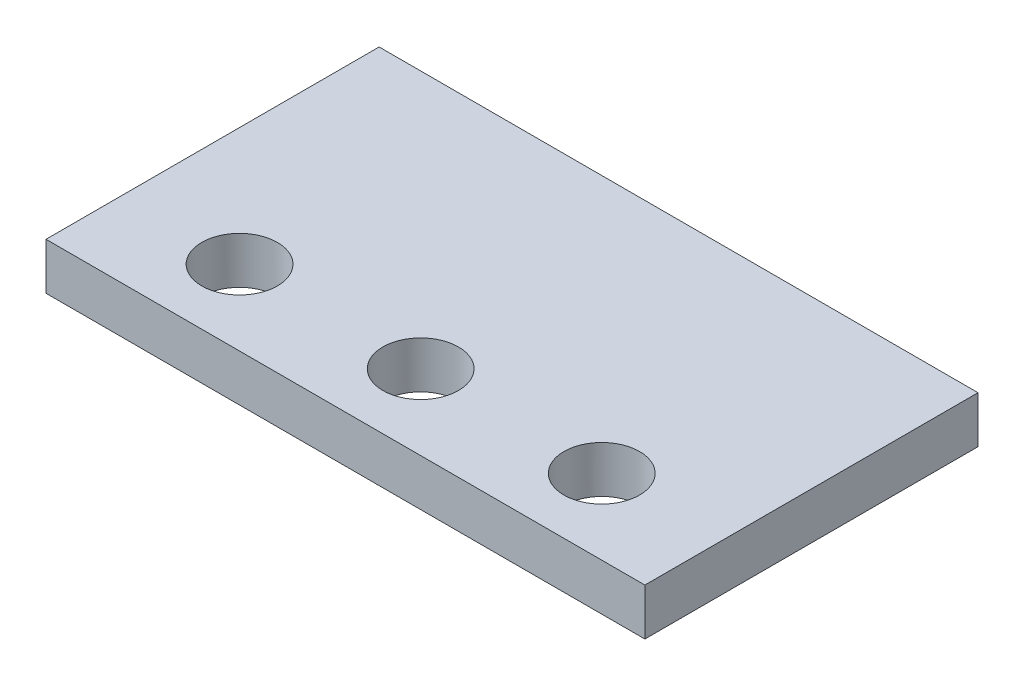
ISO-10303-21;
HEADER;
FILE_DESCRIPTION(('STEP AP214'),'2;1');
FILE_NAME('part.step','',(''),(''),'','','');
FILE_SCHEMA(('AUTOMOTIVE_DESIGN { 1 0 10303 214 1 1 1 1 }'));
ENDSEC;
DATA;
#1=APPLICATION_CONTEXT('core data for automotive mechanical design processes');
#2=APPLICATION_PROTOCOL_DEFINITION('international standard','automotive_design',2000,#1);
#3=PRODUCT_CONTEXT('',#1,'mechanical');
#4=PRODUCT('Part','Part','',(#3));
#5=PRODUCT_RELATED_PRODUCT_CATEGORY('part','',(#4));
#6=PRODUCT_DEFINITION_FORMATION('','',#4);
#7=PRODUCT_DEFINITION_CONTEXT('part definition',#1,'design');
#8=PRODUCT_DEFINITION('design','',#6,#7);
#9=PRODUCT_DEFINITION_SHAPE('','',#8);
#10=(LENGTH_UNIT() NAMED_UNIT(*) SI_UNIT(.MILLI.,.METRE.));
#11=(NAMED_UNIT(*) PLANE_ANGLE_UNIT() SI_UNIT($,.RADIAN.));
#12=(NAMED_UNIT(*) SI_UNIT($,.STERADIAN.) SOLID_ANGLE_UNIT());
#13=UNCERTAINTY_MEASURE_WITH_UNIT(LENGTH_MEASURE(1.E-05),#10,'distance_accuracy_value','');
#14=(GEOMETRIC_REPRESENTATION_CONTEXT(3) GLOBAL_UNCERTAINTY_ASSIGNED_CONTEXT((#13)) GLOBAL_UNIT_ASSIGNED_CONTEXT((#10,
#11,#12)) REPRESENTATION_CONTEXT('',''));
#15=CARTESIAN_POINT('',(0.,0.,0.));
#16=DIRECTION('',(0.,0.,1.));
#17=DIRECTION('',(1.,0.,0.));
#18=AXIS2_PLACEMENT_3D('',#15,#16,#17);
#19=CARTESIAN_POINT('',(0.,-167.165586138057,182.));
#20=DIRECTION('',(0.,1.,0.));
#21=DIRECTION('',(-1.,0.,0.));
#22=AXIS2_PLACEMENT_3D('',#19,#20,#21);
#23=PLANE('',#22);
#24=CARTESIAN_POINT('',(89.0112686576685,-167.165586138057,319.809692798291));
#25=DIRECTION('',(0.,-1.,0.));
#26=DIRECTION('',(1.,0.,0.));
#27=AXIS2_PLACEMENT_3D('',#24,#25,#26);
#28=CIRCLE('',#27,20.1903072017096);
#29=CARTESIAN_POINT('',(109.201575859378,-167.165586138057,319.809692798291));
#30=VERTEX_POINT('',#29);
#31=EDGE_CURVE('E105',#30,#30,#28,.T.);
#32=ORIENTED_EDGE('',*,*,#31,.F.);
#33=EDGE_LOOP('',(#32));
#34=FACE_BOUND('',#33,.T.);
#35=CARTESIAN_POINT('',(-7.75409298345245,-167.165586138057,319.809692798291));
#36=DIRECTION('',(0.,-1.,0.));
#37=DIRECTION('',(1.,0.,0.));
#38=AXIS2_PLACEMENT_3D('',#35,#36,#37);
#39=CIRCLE('',#38,20.1903072017096);
#40=CARTESIAN_POINT('',(12.4362142182571,-167.165586138057,319.809692798291));
#41=VERTEX_POINT('',#40);
#42=EDGE_CURVE('E121',#41,#41,#39,.T.);
#43=ORIENTED_EDGE('',*,*,#42,.F.);
#44=EDGE_LOOP('',(#43));
#45=FACE_BOUND('',#44,.T.);
#46=CARTESIAN_POINT('',(-104.519454624573,-167.165586138056,319.809692798291));
#47=DIRECTION('',(0.,-1.,0.));
#48=DIRECTION('',(1.,0.,0.));
#49=AXIS2_PLACEMENT_3D('',#46,#47,#48);
#50=CIRCLE('',#49,20.1903072017096);
#51=CARTESIAN_POINT('',(-84.3291474228638,-167.165586138056,319.809692798291));
#52=VERTEX_POINT('',#51);
#53=EDGE_CURVE('E115',#52,#52,#50,.T.);
#54=ORIENTED_EDGE('',*,*,#53,.F.);
#55=EDGE_LOOP('',(#54));
#56=FACE_BOUND('',#55,.T.);
#57=DIRECTION('',(-1.,0.,0.));
#58=VECTOR('',#57,1.);
#59=CARTESIAN_POINT('',(0.,-167.165586138057,360.));
#60=LINE('',#59,#58);
#61=CARTESIAN_POINT('',(152.245907016548,-167.165586138057,360.));
#62=VERTEX_POINT('',#61);
#63=CARTESIAN_POINT('',(-167.754092983452,-167.165586138056,360.));
#64=VERTEX_POINT('',#63);
#65=EDGE_CURVE('E103',#62,#64,#60,.T.);
#66=ORIENTED_EDGE('',*,*,#65,.T.);
#67=DIRECTION('',(0.,0.,1.));
#68=VECTOR('',#67,1.);
#69=CARTESIAN_POINT('',(-167.754092983452,-167.165586138056,182.));
#70=LINE('',#69,#68);
#71=CARTESIAN_POINT('',(-167.754092983452,-167.165586138056,182.));
#72=VERTEX_POINT('',#71);
#73=EDGE_CURVE('E11',#72,#64,#70,.T.);
#74=ORIENTED_EDGE('',*,*,#73,.F.);
#75=DIRECTION('',(-1.,0.,0.));
#76=VECTOR('',#75,1.);
#77=CARTESIAN_POINT('',(0.,-167.165586138057,182.));
#78=LINE('',#77,#76);
#79=CARTESIAN_POINT('',(152.245907016548,-167.165586138057,182.));
#80=VERTEX_POINT('',#79);
#81=EDGE_CURVE('E89',#80,#72,#78,.T.);
#82=ORIENTED_EDGE('',*,*,#81,.F.);
#83=DIRECTION('',(0.,0.,1.));
#84=VECTOR('',#83,1.);
#85=CARTESIAN_POINT('',(152.245907016548,-167.165586138057,182.));
#86=LINE('',#85,#84);
#87=EDGE_CURVE('E56',#80,#62,#86,.T.);
#88=ORIENTED_EDGE('',*,*,#87,.T.);
#89=EDGE_LOOP('',(#66,#74,#82,#88));
#90=FACE_BOUND('',#89,.T.);
#91=ADVANCED_FACE('F40',(#34,#45,#56,#90),#23,.F.);
#92=CARTESIAN_POINT('',(-167.754092983452,0.,182.));
#93=DIRECTION('',(1.,0.,0.));
#94=DIRECTION('',(0.,0.,-1.));
#95=AXIS2_PLACEMENT_3D('',#92,#93,#94);
#96=PLANE('',#95);
#97=DIRECTION('',(0.,1.,0.));
#98=VECTOR('',#97,1.);
#99=CARTESIAN_POINT('',(-167.754092983452,0.,360.));
#100=LINE('',#99,#98);
#101=CARTESIAN_POINT('',(-167.754092983452,-142.165586138056,360.));
#102=VERTEX_POINT('',#101);
#103=EDGE_CURVE('E94',#64,#102,#100,.T.);
#104=ORIENTED_EDGE('',*,*,#103,.T.);
#105=DIRECTION('',(0.,0.,1.));
#106=VECTOR('',#105,1.);
#107=CARTESIAN_POINT('',(-167.754092983452,-142.165586138056,182.));
#108=LINE('',#107,#106);
#109=CARTESIAN_POINT('',(-167.754092983452,-142.165586138056,182.));
#110=VERTEX_POINT('',#109);
#111=EDGE_CURVE('E48',#110,#102,#108,.T.);
#112=ORIENTED_EDGE('',*,*,#111,.F.);
#113=DIRECTION('',(0.,1.,0.));
#114=VECTOR('',#113,1.);
#115=CARTESIAN_POINT('',(-167.754092983452,0.,182.));
#116=LINE('',#115,#114);
#117=EDGE_CURVE('E81',#72,#110,#116,.T.);
#118=ORIENTED_EDGE('',*,*,#117,.F.);
#119=ORIENTED_EDGE('',*,*,#73,.T.);
#120=EDGE_LOOP('',(#104,#112,#118,#119));
#121=FACE_BOUND('',#120,.T.);
#122=ADVANCED_FACE('F93',(#121),#96,.F.);
#123=CARTESIAN_POINT('',(0.,-142.165586138057,182.));
#124=DIRECTION('',(0.,1.,0.));
#125=DIRECTION('',(-1.,0.,0.));
#126=AXIS2_PLACEMENT_3D('',#123,#124,#125);
#127=PLANE('',#126);
#128=CARTESIAN_POINT('',(89.0112686576685,-142.165586138057,319.809692798291));
#129=DIRECTION('',(0.,1.,0.));
#130=DIRECTION('',(-1.,0.,0.));
#131=AXIS2_PLACEMENT_3D('',#128,#129,#130);
#132=CIRCLE('',#131,20.1903072017096);
#133=CARTESIAN_POINT('',(68.8209614559589,-142.165586138057,319.809692798291));
#134=VERTEX_POINT('',#133);
#135=EDGE_CURVE('E127',#134,#134,#132,.F.);
#136=ORIENTED_EDGE('',*,*,#135,.T.);
#137=EDGE_LOOP('',(#136));
#138=FACE_BOUND('',#137,.T.);
#139=CARTESIAN_POINT('',(-7.75409298345244,-142.165586138057,319.809692798291));
#140=DIRECTION('',(0.,1.,0.));
#141=DIRECTION('',(-1.,0.,0.));
#142=AXIS2_PLACEMENT_3D('',#139,#140,#141);
#143=CIRCLE('',#142,20.1903072017096);
#144=CARTESIAN_POINT('',(-27.944400185162,-142.165586138057,319.809692798291));
#145=VERTEX_POINT('',#144);
#146=EDGE_CURVE('E124',#145,#145,#143,.F.);
#147=ORIENTED_EDGE('',*,*,#146,.T.);
#148=EDGE_LOOP('',(#147));
#149=FACE_BOUND('',#148,.T.);
#150=CARTESIAN_POINT('',(-104.519454624573,-142.165586138056,319.809692798291));
#151=DIRECTION('',(0.,1.,0.));
#152=DIRECTION('',(-1.,0.,0.));
#153=AXIS2_PLACEMENT_3D('',#150,#151,#152);
#154=CIRCLE('',#153,20.1903072017096);
#155=CARTESIAN_POINT('',(-124.709761826283,-142.165586138056,319.809692798291));
#156=VERTEX_POINT('',#155);
#157=EDGE_CURVE('E118',#156,#156,#154,.F.);
#158=ORIENTED_EDGE('',*,*,#157,.T.);
#159=EDGE_LOOP('',(#158));
#160=FACE_BOUND('',#159,.T.);
#161=DIRECTION('',(-1.,0.,0.));
#162=VECTOR('',#161,1.);
#163=CARTESIAN_POINT('',(0.,-142.165586138057,360.));
#164=LINE('',#163,#162);
#165=CARTESIAN_POINT('',(152.245907016548,-142.165586138057,360.));
#166=VERTEX_POINT('',#165);
#167=EDGE_CURVE('E107',#166,#102,#164,.T.);
#168=ORIENTED_EDGE('',*,*,#167,.F.);
#169=DIRECTION('',(0.,0.,1.));
#170=VECTOR('',#169,1.);
#171=CARTESIAN_POINT('',(152.245907016548,-142.165586138057,182.));
#172=LINE('',#171,#170);
#173=CARTESIAN_POINT('',(152.245907016548,-142.165586138057,182.));
#174=VERTEX_POINT('',#173);
#175=EDGE_CURVE('E70',#174,#166,#172,.T.);
#176=ORIENTED_EDGE('',*,*,#175,.F.);
#177=DIRECTION('',(-1.,0.,0.));
#178=VECTOR('',#177,1.);
#179=CARTESIAN_POINT('',(0.,-142.165586138057,182.));
#180=LINE('',#179,#178);
#181=EDGE_CURVE('E88',#174,#110,#180,.T.);
#182=ORIENTED_EDGE('',*,*,#181,.T.);
#183=ORIENTED_EDGE('',*,*,#111,.T.);
#184=EDGE_LOOP('',(#168,#176,#182,#183));
#185=FACE_BOUND('',#184,.T.);
#186=ADVANCED_FACE('F97',(#138,#149,#160,#185),#127,.T.);
#187=CARTESIAN_POINT('',(152.245907016548,0.,182.));
#188=DIRECTION('',(1.,0.,0.));
#189=DIRECTION('',(0.,0.,-1.));
#190=AXIS2_PLACEMENT_3D('',#187,#188,#189);
#191=PLANE('',#190);
#192=DIRECTION('',(0.,1.,0.));
#193=VECTOR('',#192,1.);
#194=CARTESIAN_POINT('',(152.245907016548,0.,360.));
#195=LINE('',#194,#193);
#196=EDGE_CURVE('E109',#62,#166,#195,.T.);
#197=ORIENTED_EDGE('',*,*,#196,.F.);
#198=ORIENTED_EDGE('',*,*,#87,.F.);
#199=DIRECTION('',(0.,1.,0.));
#200=VECTOR('',#199,1.);
#201=CARTESIAN_POINT('',(152.245907016548,0.,182.));
#202=LINE('',#201,#200);
#203=EDGE_CURVE('E98',#80,#174,#202,.T.);
#204=ORIENTED_EDGE('',*,*,#203,.T.);
#205=ORIENTED_EDGE('',*,*,#175,.T.);
#206=EDGE_LOOP('',(#197,#198,#204,#205));
#207=FACE_BOUND('',#206,.T.);
#208=ADVANCED_FACE('F141',(#207),#191,.T.);
#209=CARTESIAN_POINT('',(0.,0.,182.));
#210=DIRECTION('',(0.,0.,-1.));
#211=DIRECTION('',(-1.,0.,0.));
#212=AXIS2_PLACEMENT_3D('',#209,#210,#211);
#213=PLANE('',#212);
#214=ORIENTED_EDGE('',*,*,#81,.T.);
#215=ORIENTED_EDGE('',*,*,#117,.T.);
#216=ORIENTED_EDGE('',*,*,#181,.F.);
#217=ORIENTED_EDGE('',*,*,#203,.F.);
#218=EDGE_LOOP('',(#214,#215,#216,#217));
#219=FACE_BOUND('',#218,.T.);
#220=ADVANCED_FACE('F85',(#219),#213,.T.);
#221=CARTESIAN_POINT('',(0.,0.,360.));
#222=DIRECTION('',(0.,0.,-1.));
#223=DIRECTION('',(-1.,0.,0.));
#224=AXIS2_PLACEMENT_3D('',#221,#222,#223);
#225=PLANE('',#224);
#226=ORIENTED_EDGE('',*,*,#65,.F.);
#227=ORIENTED_EDGE('',*,*,#196,.T.);
#228=ORIENTED_EDGE('',*,*,#167,.T.);
#229=ORIENTED_EDGE('',*,*,#103,.F.);
#230=EDGE_LOOP('',(#226,#227,#228,#229));
#231=FACE_BOUND('',#230,.T.);
#232=ADVANCED_FACE('F140',(#231),#225,.F.);
#233=CARTESIAN_POINT('',(-104.519454624573,-142.164586138056,319.809692798291));
#234=DIRECTION('',(0.,-1.,0.));
#235=DIRECTION('',(1.,0.,0.));
#236=AXIS2_PLACEMENT_3D('',#233,#234,#235);
#237=CYLINDRICAL_SURFACE('',#236,20.1903072017096);
#238=ORIENTED_EDGE('',*,*,#157,.F.);
#239=EDGE_LOOP('',(#238));
#240=FACE_BOUND('',#239,.T.);
#241=ORIENTED_EDGE('',*,*,#53,.T.);
#242=EDGE_LOOP('',(#241));
#243=FACE_BOUND('',#242,.T.);
#244=ADVANCED_FACE('F170',(#240,#243),#237,.F.);
#245=CARTESIAN_POINT('',(-7.75409298345244,-142.164586138056,319.809692798291));
#246=DIRECTION('',(0.,-1.,0.));
#247=DIRECTION('',(1.,0.,0.));
#248=AXIS2_PLACEMENT_3D('',#245,#246,#247);
#249=CYLINDRICAL_SURFACE('',#248,20.1903072017096);
#250=ORIENTED_EDGE('',*,*,#146,.F.);
#251=EDGE_LOOP('',(#250));
#252=FACE_BOUND('',#251,.T.);
#253=ORIENTED_EDGE('',*,*,#42,.T.);
#254=EDGE_LOOP('',(#253));
#255=FACE_BOUND('',#254,.T.);
#256=ADVANCED_FACE('F175',(#252,#255),#249,.F.);
#257=CARTESIAN_POINT('',(89.0112686576685,-142.164586138057,319.809692798291));
#258=DIRECTION('',(0.,-1.,0.));
#259=DIRECTION('',(1.,0.,0.));
#260=AXIS2_PLACEMENT_3D('',#257,#258,#259);
#261=CYLINDRICAL_SURFACE('',#260,20.1903072017096);
#262=ORIENTED_EDGE('',*,*,#135,.F.);
#263=EDGE_LOOP('',(#262));
#264=FACE_BOUND('',#263,.T.);
#265=ORIENTED_EDGE('',*,*,#31,.T.);
#266=EDGE_LOOP('',(#265));
#267=FACE_BOUND('',#266,.T.);
#268=ADVANCED_FACE('F133',(#264,#267),#261,.F.);
#269=CLOSED_SHELL('',(#91,#122,#186,#208,#220,#232,#244,#256,#268));
#270=MANIFOLD_SOLID_BREP('B2',#269);
#271=ADVANCED_BREP_SHAPE_REPRESENTATION('',(#18,#270),#14);
#272=SHAPE_DEFINITION_REPRESENTATION(#9,#271);
ENDSEC;
END-ISO-10303-21;
